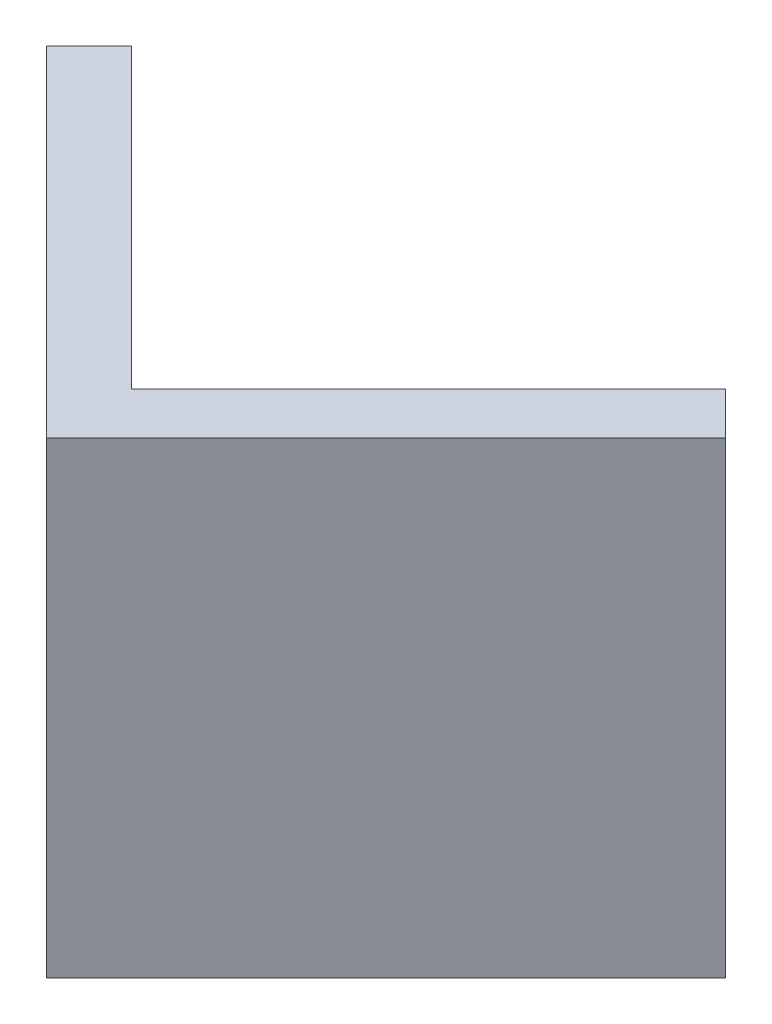
ISO-10303-21;
HEADER;
FILE_DESCRIPTION(('STEP AP214'),'2;1');
FILE_NAME('part.step','',(''),(''),'','','');
FILE_SCHEMA(('AUTOMOTIVE_DESIGN { 1 0 10303 214 1 1 1 1 }'));
ENDSEC;
DATA;
#1=APPLICATION_CONTEXT('core data for automotive mechanical design processes');
#2=APPLICATION_PROTOCOL_DEFINITION('international standard','automotive_design',2000,#1);
#3=PRODUCT_CONTEXT('',#1,'mechanical');
#4=PRODUCT('Part','Part','',(#3));
#5=PRODUCT_RELATED_PRODUCT_CATEGORY('part','',(#4));
#6=PRODUCT_DEFINITION_FORMATION('','',#4);
#7=PRODUCT_DEFINITION_CONTEXT('part definition',#1,'design');
#8=PRODUCT_DEFINITION('design','',#6,#7);
#9=PRODUCT_DEFINITION_SHAPE('','',#8);
#10=(LENGTH_UNIT() NAMED_UNIT(*) SI_UNIT(.MILLI.,.METRE.));
#11=(NAMED_UNIT(*) PLANE_ANGLE_UNIT() SI_UNIT($,.RADIAN.));
#12=(NAMED_UNIT(*) SI_UNIT($,.STERADIAN.) SOLID_ANGLE_UNIT());
#13=UNCERTAINTY_MEASURE_WITH_UNIT(LENGTH_MEASURE(1.E-05),#10,'distance_accuracy_value','');
#14=(GEOMETRIC_REPRESENTATION_CONTEXT(3) GLOBAL_UNCERTAINTY_ASSIGNED_CONTEXT((#13)) GLOBAL_UNIT_ASSIGNED_CONTEXT((#10,
#11,#12)) REPRESENTATION_CONTEXT('',''));
#15=CARTESIAN_POINT('',(0.,0.,0.));
#16=DIRECTION('',(0.,0.,1.));
#17=DIRECTION('',(1.,0.,0.));
#18=AXIS2_PLACEMENT_3D('',#15,#16,#17);
#19=CARTESIAN_POINT('',(8.2842712474618,4.,-28.284271247462));
#20=DIRECTION('',(0.70710678118655,0.,0.707106781186545));
#21=DIRECTION('',(0.707106781186545,0.,-0.70710678118655));
#22=AXIS2_PLACEMENT_3D('',#19,#20,#21);
#23=PLANE('',#22);
#24=DIRECTION('',(-0.707106781186545,0.,0.70710678118655));
#25=VECTOR('',#24,1.);
#26=CARTESIAN_POINT('',(8.2842712474618,0.,-28.284271247462));
#27=LINE('',#26,#25);
#28=CARTESIAN_POINT('',(8.2842712474618,0.,-28.284271247462));
#29=VERTEX_POINT('',#28);
#30=CARTESIAN_POINT('',(-20.,0.,0.));
#31=VERTEX_POINT('',#30);
#32=EDGE_CURVE('E153',#29,#31,#27,.T.);
#33=ORIENTED_EDGE('',*,*,#32,.T.);
#34=DIRECTION('',(0.,-1.,0.));
#35=VECTOR('',#34,1.);
#36=CARTESIAN_POINT('',(-20.,4.,0.));
#37=LINE('',#36,#35);
#38=CARTESIAN_POINT('',(-20.,39.,0.));
#39=VERTEX_POINT('',#38);
#40=EDGE_CURVE('E11',#39,#31,#37,.T.);
#41=ORIENTED_EDGE('',*,*,#40,.F.);
#42=DIRECTION('',(-0.707106781186528,0.,0.707106781186567));
#43=VECTOR('',#42,1.);
#44=CARTESIAN_POINT('',(-20.,39.,0.));
#45=LINE('',#44,#43);
#46=CARTESIAN_POINT('',(-16.4644660940674,39.,-3.53553390593283));
#47=VERTEX_POINT('',#46);
#48=EDGE_CURVE('E122',#47,#39,#45,.T.);
#49=ORIENTED_EDGE('',*,*,#48,.F.);
#50=DIRECTION('',(0.,-1.,0.));
#51=VECTOR('',#50,1.);
#52=CARTESIAN_POINT('',(-16.4644660940674,39.,-3.53553390593283));
#53=LINE('',#52,#51);
#54=CARTESIAN_POINT('',(-16.4644660940673,4.,-3.53553390593275));
#55=VERTEX_POINT('',#54);
#56=EDGE_CURVE('E139',#47,#55,#53,.T.);
#57=ORIENTED_EDGE('',*,*,#56,.T.);
#58=DIRECTION('',(-0.707106781186545,0.,0.70710678118655));
#59=VECTOR('',#58,1.);
#60=CARTESIAN_POINT('',(8.2842712474618,4.,-28.284271247462));
#61=LINE('',#60,#59);
#62=CARTESIAN_POINT('',(8.2842712474618,4.,-28.284271247462));
#63=VERTEX_POINT('',#62);
#64=EDGE_CURVE('E63',#63,#55,#61,.T.);
#65=ORIENTED_EDGE('',*,*,#64,.F.);
#66=DIRECTION('',(0.,-1.,0.));
#67=VECTOR('',#66,1.);
#68=CARTESIAN_POINT('',(8.2842712474618,4.,-28.284271247462));
#69=LINE('',#68,#67);
#70=EDGE_CURVE('E160',#63,#29,#69,.T.);
#71=ORIENTED_EDGE('',*,*,#70,.T.);
#72=EDGE_LOOP('',(#33,#41,#49,#57,#65,#71));
#73=FACE_BOUND('',#72,.T.);
#74=ADVANCED_FACE('F43',(#73),#23,.F.);
#75=CARTESIAN_POINT('',(-20.,4.,0.));
#76=DIRECTION('',(0.707106781186548,0.,-0.707106781186547));
#77=DIRECTION('',(-0.707106781186547,0.,-0.707106781186548));
#78=AXIS2_PLACEMENT_3D('',#75,#76,#77);
#79=PLANE('',#78);
#80=DIRECTION('',(0.707106781186547,0.,0.707106781186548));
#81=VECTOR('',#80,1.);
#82=CARTESIAN_POINT('',(-20.,0.,0.));
#83=LINE('',#82,#81);
#84=CARTESIAN_POINT('',(8.28427124746181,0.,28.2842712474618));
#85=VERTEX_POINT('',#84);
#86=EDGE_CURVE('E105',#31,#85,#83,.T.);
#87=ORIENTED_EDGE('',*,*,#86,.T.);
#88=DIRECTION('',(0.,-1.,0.));
#89=VECTOR('',#88,1.);
#90=CARTESIAN_POINT('',(8.28427124746181,4.,28.2842712474618));
#91=LINE('',#90,#89);
#92=CARTESIAN_POINT('',(8.28427124746181,39.,28.2842712474618));
#93=VERTEX_POINT('',#92);
#94=EDGE_CURVE('E51',#93,#85,#91,.T.);
#95=ORIENTED_EDGE('',*,*,#94,.F.);
#96=DIRECTION('',(0.707106781186547,0.,0.707106781186548));
#97=VECTOR('',#96,1.);
#98=CARTESIAN_POINT('',(8.28427124746181,39.,28.2842712474618));
#99=LINE('',#98,#97);
#100=EDGE_CURVE('E104',#39,#93,#99,.T.);
#101=ORIENTED_EDGE('',*,*,#100,.F.);
#102=ORIENTED_EDGE('',*,*,#40,.T.);
#103=EDGE_LOOP('',(#87,#95,#101,#102));
#104=FACE_BOUND('',#103,.T.);
#105=ADVANCED_FACE('F102',(#104),#79,.F.);
#106=CARTESIAN_POINT('',(36.5685424949237,4.,0.));
#107=DIRECTION('',(-0.707106781186548,0.,-0.707106781186547));
#108=DIRECTION('',(-0.707106781186547,0.,0.707106781186548));
#109=AXIS2_PLACEMENT_3D('',#106,#107,#108);
#110=PLANE('',#109);
#111=DIRECTION('',(0.707106781186547,0.,-0.707106781186548));
#112=VECTOR('',#111,1.);
#113=CARTESIAN_POINT('',(36.5685424949237,0.,0.));
#114=LINE('',#113,#112);
#115=CARTESIAN_POINT('',(36.5685424949237,0.,0.));
#116=VERTEX_POINT('',#115);
#117=EDGE_CURVE('E166',#85,#116,#114,.T.);
#118=ORIENTED_EDGE('',*,*,#117,.T.);
#119=DIRECTION('',(0.,-1.,0.));
#120=VECTOR('',#119,1.);
#121=CARTESIAN_POINT('',(36.5685424949237,4.,0.));
#122=LINE('',#121,#120);
#123=CARTESIAN_POINT('',(36.5685424949237,39.,0.));
#124=VERTEX_POINT('',#123);
#125=EDGE_CURVE('E109',#124,#116,#122,.T.);
#126=ORIENTED_EDGE('',*,*,#125,.F.);
#127=DIRECTION('',(0.707106781186547,0.,-0.707106781186548));
#128=VECTOR('',#127,1.);
#129=CARTESIAN_POINT('',(36.5685424949237,39.,0.));
#130=LINE('',#129,#128);
#131=EDGE_CURVE('E111',#93,#124,#130,.T.);
#132=ORIENTED_EDGE('',*,*,#131,.F.);
#133=ORIENTED_EDGE('',*,*,#94,.T.);
#134=EDGE_LOOP('',(#118,#126,#132,#133));
#135=FACE_BOUND('',#134,.T.);
#136=ADVANCED_FACE('F112',(#135),#110,.F.);
#137=CARTESIAN_POINT('',(8.2842712474618,4.,-28.284271247462));
#138=DIRECTION('',(-0.707106781186547,0.,0.707106781186547));
#139=DIRECTION('',(0.707106781186548,0.,0.707106781186548));
#140=AXIS2_PLACEMENT_3D('',#137,#138,#139);
#141=PLANE('',#140);
#142=DIRECTION('',(-0.707106781186548,0.,-0.707106781186548));
#143=VECTOR('',#142,1.);
#144=CARTESIAN_POINT('',(8.2842712474618,0.,-28.284271247462));
#145=LINE('',#144,#143);
#146=EDGE_CURVE('E157',#116,#29,#145,.T.);
#147=ORIENTED_EDGE('',*,*,#146,.T.);
#148=ORIENTED_EDGE('',*,*,#70,.F.);
#149=DIRECTION('',(-0.707106781186548,0.,-0.707106781186548));
#150=VECTOR('',#149,1.);
#151=CARTESIAN_POINT('',(8.2842712474618,4.,-28.284271247462));
#152=LINE('',#151,#150);
#153=CARTESIAN_POINT('',(33.033008588991,4.,-3.53553390593282));
#154=VERTEX_POINT('',#153);
#155=EDGE_CURVE('E156',#154,#63,#152,.T.);
#156=ORIENTED_EDGE('',*,*,#155,.F.);
#157=DIRECTION('',(0.,-1.,0.));
#158=VECTOR('',#157,1.);
#159=CARTESIAN_POINT('',(33.033008588991,39.,-3.53553390593283));
#160=LINE('',#159,#158);
#161=CARTESIAN_POINT('',(33.033008588991,39.,-3.53553390593283));
#162=VERTEX_POINT('',#161);
#163=EDGE_CURVE('E149',#162,#154,#160,.T.);
#164=ORIENTED_EDGE('',*,*,#163,.F.);
#165=DIRECTION('',(-0.707106781186548,0.,-0.707106781186547));
#166=VECTOR('',#165,1.);
#167=CARTESIAN_POINT('',(33.033008588991,39.,-3.53553390593283));
#168=LINE('',#167,#166);
#169=EDGE_CURVE('E117',#124,#162,#168,.T.);
#170=ORIENTED_EDGE('',*,*,#169,.F.);
#171=ORIENTED_EDGE('',*,*,#125,.T.);
#172=EDGE_LOOP('',(#147,#148,#156,#164,#170,#171));
#173=FACE_BOUND('',#172,.T.);
#174=ADVANCED_FACE('F177',(#173),#141,.F.);
#175=CARTESIAN_POINT('',(0.,4.,0.));
#176=DIRECTION('',(0.,1.,0.));
#177=DIRECTION('',(0.,0.,1.));
#178=AXIS2_PLACEMENT_3D('',#175,#176,#177);
#179=PLANE('',#178);
#180=DIRECTION('',(-0.707106781186548,0.,-0.707106781186548));
#181=VECTOR('',#180,1.);
#182=CARTESIAN_POINT('',(-16.4644660940674,4.,-3.53553390593283));
#183=LINE('',#182,#181);
#184=CARTESIAN_POINT('',(8.2842712474618,4.,21.2132034355963));
#185=VERTEX_POINT('',#184);
#186=EDGE_CURVE('E124',#185,#55,#183,.T.);
#187=ORIENTED_EDGE('',*,*,#186,.F.);
#188=DIRECTION('',(-0.707106781186547,0.,0.707106781186547));
#189=VECTOR('',#188,1.);
#190=CARTESIAN_POINT('',(8.2842712474618,4.,21.2132034355963));
#191=LINE('',#190,#189);
#192=EDGE_CURVE('E58',#154,#185,#191,.T.);
#193=ORIENTED_EDGE('',*,*,#192,.F.);
#194=ORIENTED_EDGE('',*,*,#155,.T.);
#195=ORIENTED_EDGE('',*,*,#64,.T.);
#196=EDGE_LOOP('',(#187,#193,#194,#195));
#197=FACE_BOUND('',#196,.T.);
#198=ADVANCED_FACE('F192',(#197),#179,.T.);
#199=CARTESIAN_POINT('',(0.,0.,0.));
#200=DIRECTION('',(0.,1.,0.));
#201=DIRECTION('',(0.,0.,1.));
#202=AXIS2_PLACEMENT_3D('',#199,#200,#201);
#203=PLANE('',#202);
#204=ORIENTED_EDGE('',*,*,#32,.F.);
#205=ORIENTED_EDGE('',*,*,#146,.F.);
#206=ORIENTED_EDGE('',*,*,#117,.F.);
#207=ORIENTED_EDGE('',*,*,#86,.F.);
#208=EDGE_LOOP('',(#204,#205,#206,#207));
#209=FACE_BOUND('',#208,.T.);
#210=ADVANCED_FACE('F182',(#209),#203,.F.);
#211=CARTESIAN_POINT('',(8.2842712474618,39.,21.2132034355963));
#212=DIRECTION('',(0.707106781186548,0.,0.707106781186548));
#213=DIRECTION('',(0.707106781186548,0.,-0.707106781186548));
#214=AXIS2_PLACEMENT_3D('',#211,#212,#213);
#215=PLANE('',#214);
#216=ORIENTED_EDGE('',*,*,#192,.T.);
#217=DIRECTION('',(0.,-1.,0.));
#218=VECTOR('',#217,1.);
#219=CARTESIAN_POINT('',(8.2842712474618,39.,21.2132034355963));
#220=LINE('',#219,#218);
#221=CARTESIAN_POINT('',(8.2842712474618,39.,21.2132034355963));
#222=VERTEX_POINT('',#221);
#223=EDGE_CURVE('E145',#222,#185,#220,.T.);
#224=ORIENTED_EDGE('',*,*,#223,.F.);
#225=DIRECTION('',(-0.707106781186547,0.,0.707106781186547));
#226=VECTOR('',#225,1.);
#227=CARTESIAN_POINT('',(8.2842712474618,39.,21.2132034355963));
#228=LINE('',#227,#226);
#229=EDGE_CURVE('E131',#162,#222,#228,.T.);
#230=ORIENTED_EDGE('',*,*,#229,.F.);
#231=ORIENTED_EDGE('',*,*,#163,.T.);
#232=EDGE_LOOP('',(#216,#224,#230,#231));
#233=FACE_BOUND('',#232,.T.);
#234=ADVANCED_FACE('F186',(#233),#215,.F.);
#235=CARTESIAN_POINT('',(-16.4644660940674,39.,-3.53553390593283));
#236=DIRECTION('',(-0.707106781186548,0.,0.707106781186548));
#237=DIRECTION('',(0.707106781186548,0.,0.707106781186548));
#238=AXIS2_PLACEMENT_3D('',#235,#236,#237);
#239=PLANE('',#238);
#240=ORIENTED_EDGE('',*,*,#186,.T.);
#241=ORIENTED_EDGE('',*,*,#56,.F.);
#242=DIRECTION('',(-0.707106781186548,0.,-0.707106781186548));
#243=VECTOR('',#242,1.);
#244=CARTESIAN_POINT('',(-16.4644660940674,39.,-3.53553390593283));
#245=LINE('',#244,#243);
#246=EDGE_CURVE('E134',#222,#47,#245,.T.);
#247=ORIENTED_EDGE('',*,*,#246,.F.);
#248=ORIENTED_EDGE('',*,*,#223,.T.);
#249=EDGE_LOOP('',(#240,#241,#247,#248));
#250=FACE_BOUND('',#249,.T.);
#251=ADVANCED_FACE('F191',(#250),#239,.F.);
#252=CARTESIAN_POINT('',(0.,39.,0.));
#253=DIRECTION('',(0.,-1.,0.));
#254=DIRECTION('',(0.,0.,-1.));
#255=AXIS2_PLACEMENT_3D('',#252,#253,#254);
#256=PLANE('',#255);
#257=ORIENTED_EDGE('',*,*,#100,.T.);
#258=ORIENTED_EDGE('',*,*,#131,.T.);
#259=ORIENTED_EDGE('',*,*,#169,.T.);
#260=ORIENTED_EDGE('',*,*,#229,.T.);
#261=ORIENTED_EDGE('',*,*,#246,.T.);
#262=ORIENTED_EDGE('',*,*,#48,.T.);
#263=EDGE_LOOP('',(#257,#258,#259,#260,#261,#262));
#264=FACE_BOUND('',#263,.T.);
#265=ADVANCED_FACE('F120',(#264),#256,.F.);
#266=CLOSED_SHELL('',(#74,#105,#136,#174,#198,#210,#234,#251,#265));
#267=MANIFOLD_SOLID_BREP('B2',#266);
#268=ADVANCED_BREP_SHAPE_REPRESENTATION('',(#18,#267),#14);
#269=SHAPE_DEFINITION_REPRESENTATION(#9,#268);
ENDSEC;
END-ISO-10303-21;
